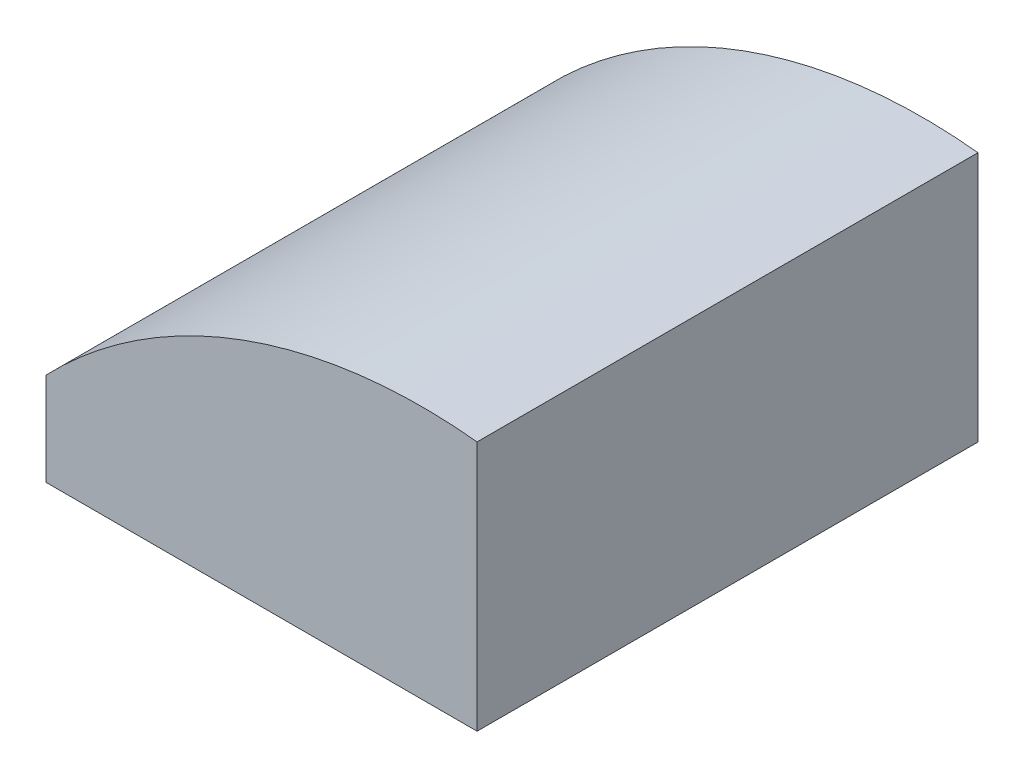
ISO-10303-21;
HEADER;
FILE_DESCRIPTION(('STEP AP214'),'2;1');
FILE_NAME('part.step','',(''),(''),'','','');
FILE_SCHEMA(('AUTOMOTIVE_DESIGN { 1 0 10303 214 1 1 1 1 }'));
ENDSEC;
DATA;
#1=APPLICATION_CONTEXT('core data for automotive mechanical design processes');
#2=APPLICATION_PROTOCOL_DEFINITION('international standard','automotive_design',2000,#1);
#3=PRODUCT_CONTEXT('',#1,'mechanical');
#4=PRODUCT('Part','Part','',(#3));
#5=PRODUCT_RELATED_PRODUCT_CATEGORY('part','',(#4));
#6=PRODUCT_DEFINITION_FORMATION('','',#4);
#7=PRODUCT_DEFINITION_CONTEXT('part definition',#1,'design');
#8=PRODUCT_DEFINITION('design','',#6,#7);
#9=PRODUCT_DEFINITION_SHAPE('','',#8);
#10=(LENGTH_UNIT() NAMED_UNIT(*) SI_UNIT(.MILLI.,.METRE.));
#11=(NAMED_UNIT(*) PLANE_ANGLE_UNIT() SI_UNIT($,.RADIAN.));
#12=(NAMED_UNIT(*) SI_UNIT($,.STERADIAN.) SOLID_ANGLE_UNIT());
#13=UNCERTAINTY_MEASURE_WITH_UNIT(LENGTH_MEASURE(1.E-05),#10,'distance_accuracy_value','');
#14=(GEOMETRIC_REPRESENTATION_CONTEXT(3) GLOBAL_UNCERTAINTY_ASSIGNED_CONTEXT((#13)) GLOBAL_UNIT_ASSIGNED_CONTEXT((#10,
#11,#12)) REPRESENTATION_CONTEXT('',''));
#15=CARTESIAN_POINT('',(0.,0.,0.));
#16=DIRECTION('',(0.,0.,1.));
#17=DIRECTION('',(1.,0.,0.));
#18=AXIS2_PLACEMENT_3D('',#15,#16,#17);
#19=CARTESIAN_POINT('',(43.7181883185697,0.,-50.8));
#20=DIRECTION('',(0.,-1.,0.));
#21=DIRECTION('',(0.,0.,-1.));
#22=AXIS2_PLACEMENT_3D('',#19,#20,#21);
#23=PLANE('',#22);
#24=DIRECTION('',(1.,0.,0.));
#25=VECTOR('',#24,1.);
#26=CARTESIAN_POINT('',(43.7181883185697,0.,0.));
#27=LINE('',#26,#25);
#28=CARTESIAN_POINT('',(0.,0.,0.));
#29=VERTEX_POINT('',#28);
#30=CARTESIAN_POINT('',(43.7181883185697,0.,0.));
#31=VERTEX_POINT('',#30);
#32=EDGE_CURVE('E95',#29,#31,#27,.T.);
#33=ORIENTED_EDGE('',*,*,#32,.F.);
#34=DIRECTION('',(0.,0.,1.));
#35=VECTOR('',#34,1.);
#36=CARTESIAN_POINT('',(0.,0.,-50.8));
#37=LINE('',#36,#35);
#38=CARTESIAN_POINT('',(0.,0.,-50.8));
#39=VERTEX_POINT('',#38);
#40=EDGE_CURVE('E11',#39,#29,#37,.T.);
#41=ORIENTED_EDGE('',*,*,#40,.F.);
#42=DIRECTION('',(1.,0.,0.));
#43=VECTOR('',#42,1.);
#44=CARTESIAN_POINT('',(43.7181883185697,0.,-50.8));
#45=LINE('',#44,#43);
#46=CARTESIAN_POINT('',(43.7181883185697,0.,-50.8));
#47=VERTEX_POINT('',#46);
#48=EDGE_CURVE('E89',#39,#47,#45,.T.);
#49=ORIENTED_EDGE('',*,*,#48,.T.);
#50=DIRECTION('',(0.,0.,1.));
#51=VECTOR('',#50,1.);
#52=CARTESIAN_POINT('',(43.7181883185697,0.,-50.8));
#53=LINE('',#52,#51);
#54=EDGE_CURVE('E34',#47,#31,#53,.T.);
#55=ORIENTED_EDGE('',*,*,#54,.T.);
#56=EDGE_LOOP('',(#33,#41,#49,#55));
#57=FACE_BOUND('',#56,.T.);
#58=ADVANCED_FACE('F31',(#57),#23,.T.);
#59=CARTESIAN_POINT('',(0.,0.,-50.8));
#60=DIRECTION('',(-1.,0.,0.));
#61=DIRECTION('',(0.,0.,1.));
#62=AXIS2_PLACEMENT_3D('',#59,#60,#61);
#63=PLANE('',#62);
#64=DIRECTION('',(0.,-1.,0.));
#65=VECTOR('',#64,1.);
#66=CARTESIAN_POINT('',(0.,0.,0.));
#67=LINE('',#66,#65);
#68=CARTESIAN_POINT('',(0.,9.42016509433963,0.));
#69=VERTEX_POINT('',#68);
#70=EDGE_CURVE('E91',#69,#29,#67,.T.);
#71=ORIENTED_EDGE('',*,*,#70,.F.);
#72=DIRECTION('',(0.,0.,1.));
#73=VECTOR('',#72,1.);
#74=CARTESIAN_POINT('',(0.,9.42016509433963,-50.8));
#75=LINE('',#74,#73);
#76=CARTESIAN_POINT('',(0.,9.42016509433963,-50.8));
#77=VERTEX_POINT('',#76);
#78=EDGE_CURVE('E40',#77,#69,#75,.T.);
#79=ORIENTED_EDGE('',*,*,#78,.F.);
#80=DIRECTION('',(0.,-1.,0.));
#81=VECTOR('',#80,1.);
#82=CARTESIAN_POINT('',(0.,0.,-50.8));
#83=LINE('',#82,#81);
#84=EDGE_CURVE('E86',#77,#39,#83,.T.);
#85=ORIENTED_EDGE('',*,*,#84,.T.);
#86=ORIENTED_EDGE('',*,*,#40,.T.);
#87=EDGE_LOOP('',(#71,#79,#85,#86));
#88=FACE_BOUND('',#87,.T.);
#89=ADVANCED_FACE('F105',(#88),#63,.T.);
#90=CARTESIAN_POINT('',(38.1424743702449,-27.0936046567455,-50.8));
#91=DIRECTION('',(0.,0.,1.));
#92=DIRECTION('',(1.,0.,0.));
#93=AXIS2_PLACEMENT_3D('',#90,#91,#92);
#94=CYLINDRICAL_SURFACE('',#93,52.802497407983);
#95=CARTESIAN_POINT('',(38.1424743702449,-27.0936046567455,0.));
#96=DIRECTION('',(0.,0.,1.));
#97=DIRECTION('',(-1.,0.,0.));
#98=AXIS2_PLACEMENT_3D('',#95,#96,#97);
#99=CIRCLE('',#98,52.802497407983);
#100=CARTESIAN_POINT('',(43.7181883185697,25.413681946987,0.));
#101=VERTEX_POINT('',#100);
#102=EDGE_CURVE('E81',#101,#69,#99,.T.);
#103=ORIENTED_EDGE('',*,*,#102,.F.);
#104=DIRECTION('',(0.,0.,1.));
#105=VECTOR('',#104,1.);
#106=CARTESIAN_POINT('',(43.7181883185697,25.413681946987,-50.8));
#107=LINE('',#106,#105);
#108=CARTESIAN_POINT('',(43.7181883185697,25.413681946987,-50.8));
#109=VERTEX_POINT('',#108);
#110=EDGE_CURVE('E76',#109,#101,#107,.T.);
#111=ORIENTED_EDGE('',*,*,#110,.F.);
#112=CARTESIAN_POINT('',(38.1424743702449,-27.0936046567455,-50.8));
#113=DIRECTION('',(0.,0.,1.));
#114=DIRECTION('',(-1.,0.,0.));
#115=AXIS2_PLACEMENT_3D('',#112,#113,#114);
#116=CIRCLE('',#115,52.802497407983);
#117=EDGE_CURVE('E79',#109,#77,#116,.T.);
#118=ORIENTED_EDGE('',*,*,#117,.T.);
#119=ORIENTED_EDGE('',*,*,#78,.T.);
#120=EDGE_LOOP('',(#103,#111,#118,#119));
#121=FACE_BOUND('',#120,.T.);
#122=ADVANCED_FACE('F78',(#121),#94,.T.);
#123=CARTESIAN_POINT('',(43.7181883185697,25.413681946987,-50.8));
#124=DIRECTION('',(1.,0.,0.));
#125=DIRECTION('',(0.,0.,-1.));
#126=AXIS2_PLACEMENT_3D('',#123,#124,#125);
#127=PLANE('',#126);
#128=DIRECTION('',(0.,1.,0.));
#129=VECTOR('',#128,1.);
#130=CARTESIAN_POINT('',(43.7181883185697,25.413681946987,0.));
#131=LINE('',#130,#129);
#132=EDGE_CURVE('E98',#31,#101,#131,.T.);
#133=ORIENTED_EDGE('',*,*,#132,.F.);
#134=ORIENTED_EDGE('',*,*,#54,.F.);
#135=DIRECTION('',(0.,1.,0.));
#136=VECTOR('',#135,1.);
#137=CARTESIAN_POINT('',(43.7181883185697,25.413681946987,-50.8));
#138=LINE('',#137,#136);
#139=EDGE_CURVE('E85',#47,#109,#138,.T.);
#140=ORIENTED_EDGE('',*,*,#139,.T.);
#141=ORIENTED_EDGE('',*,*,#110,.T.);
#142=EDGE_LOOP('',(#133,#134,#140,#141));
#143=FACE_BOUND('',#142,.T.);
#144=ADVANCED_FACE('F88',(#143),#127,.T.);
#145=CARTESIAN_POINT('',(38.1424743702449,-27.0936046567455,-50.8));
#146=DIRECTION('',(0.,0.,-1.));
#147=DIRECTION('',(-1.,0.,0.));
#148=AXIS2_PLACEMENT_3D('',#145,#146,#147);
#149=PLANE('',#148);
#150=ORIENTED_EDGE('',*,*,#48,.F.);
#151=ORIENTED_EDGE('',*,*,#84,.F.);
#152=ORIENTED_EDGE('',*,*,#117,.F.);
#153=ORIENTED_EDGE('',*,*,#139,.F.);
#154=EDGE_LOOP('',(#150,#151,#152,#153));
#155=FACE_BOUND('',#154,.T.);
#156=ADVANCED_FACE('F84',(#155),#149,.T.);
#157=CARTESIAN_POINT('',(38.1424743702449,-27.0936046567455,0.));
#158=DIRECTION('',(0.,0.,-1.));
#159=DIRECTION('',(-1.,0.,0.));
#160=AXIS2_PLACEMENT_3D('',#157,#158,#159);
#161=PLANE('',#160);
#162=ORIENTED_EDGE('',*,*,#32,.T.);
#163=ORIENTED_EDGE('',*,*,#132,.T.);
#164=ORIENTED_EDGE('',*,*,#102,.T.);
#165=ORIENTED_EDGE('',*,*,#70,.T.);
#166=EDGE_LOOP('',(#162,#163,#164,#165));
#167=FACE_BOUND('',#166,.T.);
#168=ADVANCED_FACE('F104',(#167),#161,.F.);
#169=CLOSED_SHELL('',(#58,#89,#122,#144,#156,#168));
#170=MANIFOLD_SOLID_BREP('B2',#169);
#171=ADVANCED_BREP_SHAPE_REPRESENTATION('',(#18,#170),#14);
#172=SHAPE_DEFINITION_REPRESENTATION(#9,#171);
ENDSEC;
END-ISO-10303-21;
